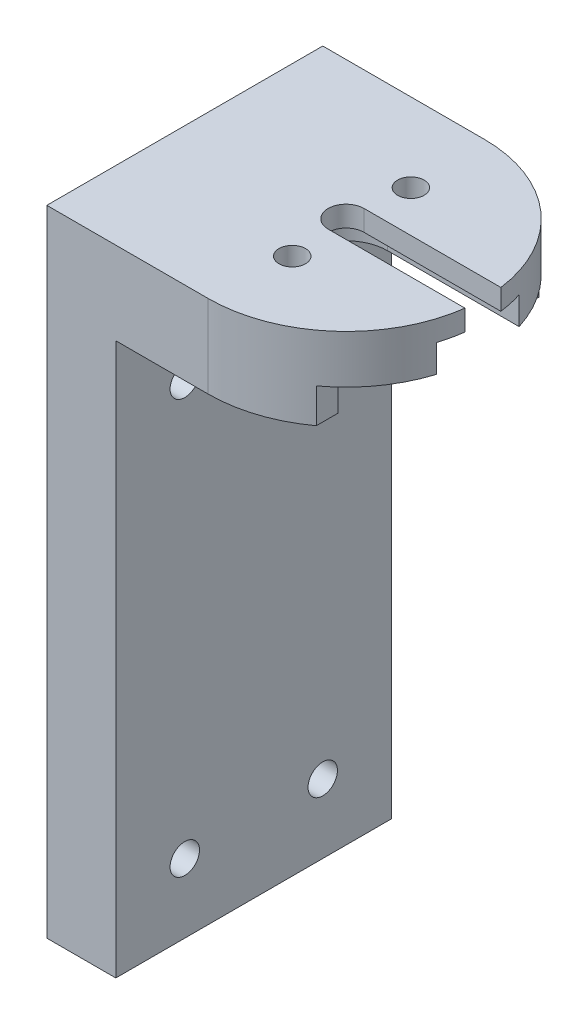
ISO-10303-21;
HEADER;
FILE_DESCRIPTION(('STEP AP214'),'2;1');
FILE_NAME('part.step','',(''),(''),'','','');
FILE_SCHEMA(('AUTOMOTIVE_DESIGN { 1 0 10303 214 1 1 1 1 }'));
ENDSEC;
DATA;
#1=APPLICATION_CONTEXT('core data for automotive mechanical design processes');
#2=APPLICATION_PROTOCOL_DEFINITION('international standard','automotive_design',2000,#1);
#3=PRODUCT_CONTEXT('',#1,'mechanical');
#4=PRODUCT('Part','Part','',(#3));
#5=PRODUCT_RELATED_PRODUCT_CATEGORY('part','',(#4));
#6=PRODUCT_DEFINITION_FORMATION('','',#4);
#7=PRODUCT_DEFINITION_CONTEXT('part definition',#1,'design');
#8=PRODUCT_DEFINITION('design','',#6,#7);
#9=PRODUCT_DEFINITION_SHAPE('','',#8);
#10=(LENGTH_UNIT() NAMED_UNIT(*) SI_UNIT(.MILLI.,.METRE.));
#11=(NAMED_UNIT(*) PLANE_ANGLE_UNIT() SI_UNIT($,.RADIAN.));
#12=(NAMED_UNIT(*) SI_UNIT($,.STERADIAN.) SOLID_ANGLE_UNIT());
#13=UNCERTAINTY_MEASURE_WITH_UNIT(LENGTH_MEASURE(1.E-05),#10,'distance_accuracy_value','');
#14=(GEOMETRIC_REPRESENTATION_CONTEXT(3) GLOBAL_UNCERTAINTY_ASSIGNED_CONTEXT((#13)) GLOBAL_UNIT_ASSIGNED_CONTEXT((#10,
#11,#12)) REPRESENTATION_CONTEXT('',''));
#15=CARTESIAN_POINT('',(0.,0.,0.));
#16=DIRECTION('',(0.,0.,1.));
#17=DIRECTION('',(1.,0.,0.));
#18=AXIS2_PLACEMENT_3D('',#15,#16,#17);
#19=CARTESIAN_POINT('',(-7.502,26.9920978176793,12.7));
#20=DIRECTION('',(0.,-1.,0.));
#21=DIRECTION('',(0.,0.,-1.));
#22=AXIS2_PLACEMENT_3D('',#19,#20,#21);
#23=CYLINDRICAL_SURFACE('',#22,1.651);
#24=CARTESIAN_POINT('',(-7.502,2.54,12.7));
#25=DIRECTION('',(0.,-1.,0.));
#26=DIRECTION('',(0.,0.,-1.));
#27=AXIS2_PLACEMENT_3D('',#24,#25,#26);
#28=CIRCLE('',#27,1.651);
#29=CARTESIAN_POINT('',(-7.502,2.54,11.049));
#30=VERTEX_POINT('',#29);
#31=CARTESIAN_POINT('',(-7.502,2.54,14.351));
#32=VERTEX_POINT('',#31);
#33=EDGE_CURVE('E322',#30,#32,#28,.F.);
#34=ORIENTED_EDGE('',*,*,#33,.F.);
#35=DIRECTION('',(0.,-1.,0.));
#36=VECTOR('',#35,1.);
#37=CARTESIAN_POINT('',(-7.502,26.9920978176793,11.049));
#38=LINE('',#37,#36);
#39=CARTESIAN_POINT('',(-7.502,4.44499999999999,11.049));
#40=VERTEX_POINT('',#39);
#41=EDGE_CURVE('E324',#40,#30,#38,.T.);
#42=ORIENTED_EDGE('',*,*,#41,.F.);
#43=CARTESIAN_POINT('',(-7.502,4.44499999999999,12.7));
#44=DIRECTION('',(0.,-1.,0.));
#45=DIRECTION('',(1.,0.,0.));
#46=AXIS2_PLACEMENT_3D('',#43,#44,#45);
#47=CIRCLE('',#46,1.651);
#48=CARTESIAN_POINT('',(-7.502,4.44499999999999,14.351));
#49=VERTEX_POINT('',#48);
#50=EDGE_CURVE('E327',#40,#49,#47,.F.);
#51=ORIENTED_EDGE('',*,*,#50,.T.);
#52=DIRECTION('',(0.,-1.,0.));
#53=VECTOR('',#52,1.);
#54=CARTESIAN_POINT('',(-7.502,26.9920978176793,14.351));
#55=LINE('',#54,#53);
#56=EDGE_CURVE('E328',#49,#32,#55,.T.);
#57=ORIENTED_EDGE('',*,*,#56,.T.);
#58=EDGE_LOOP('',(#34,#42,#51,#57));
#59=FACE_BOUND('',#58,.T.);
#60=ADVANCED_FACE('F57',(#59),#23,.F.);
#61=CARTESIAN_POINT('',(-7.502,26.9920978176793,14.351));
#62=DIRECTION('',(0.,0.,1.));
#63=DIRECTION('',(1.,0.,0.));
#64=AXIS2_PLACEMENT_3D('',#61,#62,#63);
#65=PLANE('',#64);
#66=DIRECTION('',(1.,0.,0.));
#67=VECTOR('',#66,1.);
#68=CARTESIAN_POINT('',(-7.50199999999999,4.44499999999999,14.351));
#69=LINE('',#68,#67);
#70=CARTESIAN_POINT('',(5.09022772189258,4.445,14.351));
#71=VERTEX_POINT('',#70);
#72=EDGE_CURVE('E325',#49,#71,#69,.T.);
#73=ORIENTED_EDGE('',*,*,#72,.T.);
#74=DIRECTION('',(0.,1.,0.));
#75=VECTOR('',#74,1.);
#76=CARTESIAN_POINT('',(5.09022772189259,-48.9655011983927,14.351));
#77=LINE('',#76,#75);
#78=CARTESIAN_POINT('',(5.09022772189258,2.54,14.351));
#79=VERTEX_POINT('',#78);
#80=EDGE_CURVE('E197',#71,#79,#77,.F.);
#81=ORIENTED_EDGE('',*,*,#80,.T.);
#82=DIRECTION('',(1.,0.,0.));
#83=VECTOR('',#82,1.);
#84=CARTESIAN_POINT('',(-7.502,2.54,14.351));
#85=LINE('',#84,#83);
#86=EDGE_CURVE('E317',#32,#79,#85,.T.);
#87=ORIENTED_EDGE('',*,*,#86,.F.);
#88=ORIENTED_EDGE('',*,*,#56,.F.);
#89=EDGE_LOOP('',(#73,#81,#87,#88));
#90=FACE_BOUND('',#89,.T.);
#91=ADVANCED_FACE('F397',(#90),#65,.F.);
#92=CARTESIAN_POINT('',(-7.502,26.9920978176793,11.049));
#93=DIRECTION('',(0.,0.,-1.));
#94=DIRECTION('',(-1.,0.,0.));
#95=AXIS2_PLACEMENT_3D('',#92,#93,#94);
#96=PLANE('',#95);
#97=DIRECTION('',(-1.,0.,0.));
#98=VECTOR('',#97,1.);
#99=CARTESIAN_POINT('',(-7.502,2.54,11.049));
#100=LINE('',#99,#98);
#101=CARTESIAN_POINT('',(5.09022772189258,2.54,11.049));
#102=VERTEX_POINT('',#101);
#103=EDGE_CURVE('E65',#102,#30,#100,.T.);
#104=ORIENTED_EDGE('',*,*,#103,.F.);
#105=DIRECTION('',(0.,1.,0.));
#106=VECTOR('',#105,1.);
#107=CARTESIAN_POINT('',(5.09022772189259,-48.9655011983927,11.049));
#108=LINE('',#107,#106);
#109=CARTESIAN_POINT('',(5.09022772189258,4.445,11.049));
#110=VERTEX_POINT('',#109);
#111=EDGE_CURVE('E384',#102,#110,#108,.T.);
#112=ORIENTED_EDGE('',*,*,#111,.T.);
#113=DIRECTION('',(-1.,0.,0.));
#114=VECTOR('',#113,1.);
#115=CARTESIAN_POINT('',(-7.50199999999999,4.44499999999999,11.049));
#116=LINE('',#115,#114);
#117=EDGE_CURVE('E330',#110,#40,#116,.T.);
#118=ORIENTED_EDGE('',*,*,#117,.T.);
#119=ORIENTED_EDGE('',*,*,#41,.T.);
#120=EDGE_LOOP('',(#104,#112,#118,#119));
#121=FACE_BOUND('',#120,.T.);
#122=ADVANCED_FACE('F406',(#121),#96,.F.);
#123=CARTESIAN_POINT('',(-16.002,-3.175,25.4));
#124=DIRECTION('',(0.,1.,0.));
#125=DIRECTION('',(-1.,0.,0.));
#126=AXIS2_PLACEMENT_3D('',#123,#124,#125);
#127=PLANE('',#126);
#128=DIRECTION('',(1.,0.,0.));
#129=VECTOR('',#128,1.);
#130=CARTESIAN_POINT('',(-16.002,-3.175,0.));
#131=LINE('',#130,#129);
#132=CARTESIAN_POINT('',(-16.002,-3.175,0.));
#133=VERTEX_POINT('',#132);
#134=CARTESIAN_POINT('',(-7.50199999999999,-3.175,0.));
#135=VERTEX_POINT('',#134);
#136=EDGE_CURVE('E234',#133,#135,#131,.T.);
#137=ORIENTED_EDGE('',*,*,#136,.T.);
#138=CARTESIAN_POINT('',(-7.50199999999999,-3.175,12.7));
#139=DIRECTION('',(0.,1.,0.));
#140=DIRECTION('',(-1.,0.,0.));
#141=AXIS2_PLACEMENT_3D('',#138,#139,#140);
#142=CIRCLE('',#141,12.7);
#143=CARTESIAN_POINT('',(0.,-3.175,2.45256149079195));
#144=VERTEX_POINT('',#143);
#145=EDGE_CURVE('E372',#144,#135,#142,.T.);
#146=ORIENTED_EDGE('',*,*,#145,.F.);
#147=DIRECTION('',(0.,0.,-1.));
#148=VECTOR('',#147,1.);
#149=CARTESIAN_POINT('',(0.,-3.175,25.4));
#150=LINE('',#149,#148);
#151=CARTESIAN_POINT('',(0.,-3.175,4.445));
#152=VERTEX_POINT('',#151);
#153=EDGE_CURVE('E242',#152,#144,#150,.T.);
#154=ORIENTED_EDGE('',*,*,#153,.F.);
#155=DIRECTION('',(1.,0.,0.));
#156=VECTOR('',#155,1.);
#157=CARTESIAN_POINT('',(-32.628474498758,-3.175,4.445));
#158=LINE('',#157,#156);
#159=CARTESIAN_POINT('',(-16.002,-3.175,4.445));
#160=VERTEX_POINT('',#159);
#161=EDGE_CURVE('E336',#160,#152,#158,.T.);
#162=ORIENTED_EDGE('',*,*,#161,.F.);
#163=DIRECTION('',(0.,0.,-1.));
#164=VECTOR('',#163,1.);
#165=CARTESIAN_POINT('',(-16.002,-3.175,25.4));
#166=LINE('',#165,#164);
#167=EDGE_CURVE('E245',#160,#133,#166,.T.);
#168=ORIENTED_EDGE('',*,*,#167,.T.);
#169=EDGE_LOOP('',(#137,#146,#154,#162,#168));
#170=FACE_BOUND('',#169,.T.);
#171=ADVANCED_FACE('F423',(#170),#127,.F.);
#172=CARTESIAN_POINT('',(0.,-3.175,25.4));
#173=DIRECTION('',(-1.,0.,0.));
#174=DIRECTION('',(0.,0.,1.));
#175=AXIS2_PLACEMENT_3D('',#172,#173,#174);
#176=PLANE('',#175);
#177=ORIENTED_EDGE('',*,*,#153,.T.);
#178=DIRECTION('',(0.,1.,0.));
#179=VECTOR('',#178,1.);
#180=CARTESIAN_POINT('',(0.,-48.9655011983927,2.45256149079195));
#181=LINE('',#180,#179);
#182=CARTESIAN_POINT('',(0.,0.,2.45256149079195));
#183=VERTEX_POINT('',#182);
#184=EDGE_CURVE('E381',#144,#183,#181,.T.);
#185=ORIENTED_EDGE('',*,*,#184,.T.);
#186=DIRECTION('',(0.,0.,-1.));
#187=VECTOR('',#186,1.);
#188=CARTESIAN_POINT('',(0.,0.,25.4));
#189=LINE('',#188,#187);
#190=CARTESIAN_POINT('',(0.,0.,4.445));
#191=VERTEX_POINT('',#190);
#192=EDGE_CURVE('E219',#191,#183,#189,.T.);
#193=ORIENTED_EDGE('',*,*,#192,.F.);
#194=DIRECTION('',(0.,-1.,0.));
#195=VECTOR('',#194,1.);
#196=CARTESIAN_POINT('',(0.,0.,4.445));
#197=LINE('',#196,#195);
#198=EDGE_CURVE('E337',#191,#152,#197,.T.);
#199=ORIENTED_EDGE('',*,*,#198,.T.);
#200=EDGE_LOOP('',(#177,#185,#193,#199));
#201=FACE_BOUND('',#200,.T.);
#202=ADVANCED_FACE('F436',(#201),#176,.F.);
#203=CARTESIAN_POINT('',(-22.352,4.44499999999999,25.4));
#204=DIRECTION('',(1.,0.,0.));
#205=DIRECTION('',(0.,1.,0.));
#206=AXIS2_PLACEMENT_3D('',#203,#204,#205);
#207=PLANE('',#206);
#208=CARTESIAN_POINT('',(-22.352,-9.525,6.35));
#209=DIRECTION('',(-1.,0.,0.));
#210=DIRECTION('',(0.,0.,1.));
#211=AXIS2_PLACEMENT_3D('',#208,#209,#210);
#212=CIRCLE('',#211,1.35255);
#213=CARTESIAN_POINT('',(-22.352,-9.525,7.70255));
#214=VERTEX_POINT('',#213);
#215=EDGE_CURVE('E270',#214,#214,#212,.T.);
#216=ORIENTED_EDGE('',*,*,#215,.F.);
#217=EDGE_LOOP('',(#216));
#218=FACE_BOUND('',#217,.T.);
#219=CARTESIAN_POINT('',(-22.352,-9.525,19.05));
#220=DIRECTION('',(-1.,0.,0.));
#221=DIRECTION('',(0.,0.,1.));
#222=AXIS2_PLACEMENT_3D('',#219,#220,#221);
#223=CIRCLE('',#222,1.35255);
#224=CARTESIAN_POINT('',(-22.352,-9.525,20.40255));
#225=VERTEX_POINT('',#224);
#226=EDGE_CURVE('E267',#225,#225,#223,.T.);
#227=ORIENTED_EDGE('',*,*,#226,.F.);
#228=EDGE_LOOP('',(#227));
#229=FACE_BOUND('',#228,.T.);
#230=CARTESIAN_POINT('',(-22.352,-47.625,6.35));
#231=DIRECTION('',(-1.,0.,0.));
#232=DIRECTION('',(0.,0.,1.));
#233=AXIS2_PLACEMENT_3D('',#230,#231,#232);
#234=CIRCLE('',#233,1.35255);
#235=CARTESIAN_POINT('',(-22.352,-47.625,7.70255));
#236=VERTEX_POINT('',#235);
#237=EDGE_CURVE('E264',#236,#236,#234,.T.);
#238=ORIENTED_EDGE('',*,*,#237,.F.);
#239=EDGE_LOOP('',(#238));
#240=FACE_BOUND('',#239,.T.);
#241=CARTESIAN_POINT('',(-22.352,-47.625,19.05));
#242=DIRECTION('',(-1.,0.,0.));
#243=DIRECTION('',(0.,0.,1.));
#244=AXIS2_PLACEMENT_3D('',#241,#242,#243);
#245=CIRCLE('',#244,1.35255);
#246=CARTESIAN_POINT('',(-22.352,-47.625,20.40255));
#247=VERTEX_POINT('',#246);
#248=EDGE_CURVE('E260',#247,#247,#245,.T.);
#249=ORIENTED_EDGE('',*,*,#248,.F.);
#250=EDGE_LOOP('',(#249));
#251=FACE_BOUND('',#250,.T.);
#252=DIRECTION('',(0.,-1.,0.));
#253=VECTOR('',#252,1.);
#254=CARTESIAN_POINT('',(-22.352,4.44499999999999,0.));
#255=LINE('',#254,#253);
#256=CARTESIAN_POINT('',(-22.352,4.44499999999999,0.));
#257=VERTEX_POINT('',#256);
#258=CARTESIAN_POINT('',(-22.352,-53.975,0.));
#259=VERTEX_POINT('',#258);
#260=EDGE_CURVE('E225',#257,#259,#255,.T.);
#261=ORIENTED_EDGE('',*,*,#260,.T.);
#262=DIRECTION('',(0.,0.,-1.));
#263=VECTOR('',#262,1.);
#264=CARTESIAN_POINT('',(-22.352,-53.975,25.4));
#265=LINE('',#264,#263);
#266=CARTESIAN_POINT('',(-22.352,-53.975,25.4));
#267=VERTEX_POINT('',#266);
#268=EDGE_CURVE('E252',#267,#259,#265,.T.);
#269=ORIENTED_EDGE('',*,*,#268,.F.);
#270=DIRECTION('',(0.,-1.,0.));
#271=VECTOR('',#270,1.);
#272=CARTESIAN_POINT('',(-22.352,4.44499999999999,25.4));
#273=LINE('',#272,#271);
#274=CARTESIAN_POINT('',(-22.352,4.44499999999999,25.4));
#275=VERTEX_POINT('',#274);
#276=EDGE_CURVE('E238',#275,#267,#273,.T.);
#277=ORIENTED_EDGE('',*,*,#276,.F.);
#278=DIRECTION('',(0.,0.,-1.));
#279=VECTOR('',#278,1.);
#280=CARTESIAN_POINT('',(-22.352,4.44499999999999,25.4));
#281=LINE('',#280,#279);
#282=EDGE_CURVE('E216',#275,#257,#281,.T.);
#283=ORIENTED_EDGE('',*,*,#282,.T.);
#284=EDGE_LOOP('',(#261,#269,#277,#283));
#285=FACE_BOUND('',#284,.T.);
#286=ADVANCED_FACE('F59',(#218,#229,#240,#251,#285),#207,.F.);
#287=CARTESIAN_POINT('',(-22.352,-53.975,25.4));
#288=DIRECTION('',(0.,1.,0.));
#289=DIRECTION('',(0.,0.,1.));
#290=AXIS2_PLACEMENT_3D('',#287,#288,#289);
#291=PLANE('',#290);
#292=DIRECTION('',(1.,0.,0.));
#293=VECTOR('',#292,1.);
#294=CARTESIAN_POINT('',(-22.352,-53.975,0.));
#295=LINE('',#294,#293);
#296=CARTESIAN_POINT('',(-16.002,-53.975,0.));
#297=VERTEX_POINT('',#296);
#298=EDGE_CURVE('E228',#259,#297,#295,.T.);
#299=ORIENTED_EDGE('',*,*,#298,.T.);
#300=DIRECTION('',(0.,0.,-1.));
#301=VECTOR('',#300,1.);
#302=CARTESIAN_POINT('',(-16.002,-53.975,25.4));
#303=LINE('',#302,#301);
#304=CARTESIAN_POINT('',(-16.002,-53.975,25.4));
#305=VERTEX_POINT('',#304);
#306=EDGE_CURVE('E249',#305,#297,#303,.T.);
#307=ORIENTED_EDGE('',*,*,#306,.F.);
#308=DIRECTION('',(1.,0.,0.));
#309=VECTOR('',#308,1.);
#310=CARTESIAN_POINT('',(-22.352,-53.975,25.4));
#311=LINE('',#310,#309);
#312=EDGE_CURVE('E360',#267,#305,#311,.T.);
#313=ORIENTED_EDGE('',*,*,#312,.F.);
#314=ORIENTED_EDGE('',*,*,#268,.T.);
#315=EDGE_LOOP('',(#299,#307,#313,#314));
#316=FACE_BOUND('',#315,.T.);
#317=ADVANCED_FACE('F419',(#316),#291,.F.);
#318=CARTESIAN_POINT('',(-16.002,-53.975,25.4));
#319=DIRECTION('',(-1.,0.,0.));
#320=DIRECTION('',(0.,0.,1.));
#321=AXIS2_PLACEMENT_3D('',#318,#319,#320);
#322=PLANE('',#321);
#323=CARTESIAN_POINT('',(-16.002,-9.525,6.35));
#324=DIRECTION('',(-1.,0.,0.));
#325=DIRECTION('',(0.,0.,1.));
#326=AXIS2_PLACEMENT_3D('',#323,#324,#325);
#327=CIRCLE('',#326,1.35255);
#328=CARTESIAN_POINT('',(-16.002,-9.525,7.70255));
#329=VERTEX_POINT('',#328);
#330=EDGE_CURVE('E268',#329,#329,#327,.T.);
#331=ORIENTED_EDGE('',*,*,#330,.T.);
#332=EDGE_LOOP('',(#331));
#333=FACE_BOUND('',#332,.T.);
#334=CARTESIAN_POINT('',(-16.002,-9.525,19.05));
#335=DIRECTION('',(-1.,0.,0.));
#336=DIRECTION('',(0.,0.,1.));
#337=AXIS2_PLACEMENT_3D('',#334,#335,#336);
#338=CIRCLE('',#337,1.35255);
#339=CARTESIAN_POINT('',(-16.002,-9.525,20.40255));
#340=VERTEX_POINT('',#339);
#341=EDGE_CURVE('E265',#340,#340,#338,.T.);
#342=ORIENTED_EDGE('',*,*,#341,.T.);
#343=EDGE_LOOP('',(#342));
#344=FACE_BOUND('',#343,.T.);
#345=CARTESIAN_POINT('',(-16.002,-47.625,6.35));
#346=DIRECTION('',(-1.,0.,0.));
#347=DIRECTION('',(0.,0.,1.));
#348=AXIS2_PLACEMENT_3D('',#345,#346,#347);
#349=CIRCLE('',#348,1.35255);
#350=CARTESIAN_POINT('',(-16.002,-47.625,7.70255));
#351=VERTEX_POINT('',#350);
#352=EDGE_CURVE('E261',#351,#351,#349,.T.);
#353=ORIENTED_EDGE('',*,*,#352,.T.);
#354=EDGE_LOOP('',(#353));
#355=FACE_BOUND('',#354,.T.);
#356=CARTESIAN_POINT('',(-16.002,-47.625,19.05));
#357=DIRECTION('',(-1.,0.,0.));
#358=DIRECTION('',(0.,0.,1.));
#359=AXIS2_PLACEMENT_3D('',#356,#357,#358);
#360=CIRCLE('',#359,1.35255);
#361=CARTESIAN_POINT('',(-16.002,-47.625,20.40255));
#362=VERTEX_POINT('',#361);
#363=EDGE_CURVE('E256',#362,#362,#360,.T.);
#364=ORIENTED_EDGE('',*,*,#363,.T.);
#365=EDGE_LOOP('',(#364));
#366=FACE_BOUND('',#365,.T.);
#367=DIRECTION('',(0.,1.,0.));
#368=VECTOR('',#367,1.);
#369=CARTESIAN_POINT('',(-16.002,-53.975,0.));
#370=LINE('',#369,#368);
#371=EDGE_CURVE('E231',#297,#133,#370,.T.);
#372=ORIENTED_EDGE('',*,*,#371,.T.);
#373=ORIENTED_EDGE('',*,*,#167,.F.);
#374=DIRECTION('',(0.,-1.,0.));
#375=VECTOR('',#374,1.);
#376=CARTESIAN_POINT('',(-16.002,0.,4.445));
#377=LINE('',#376,#375);
#378=CARTESIAN_POINT('',(-16.002,0.,4.445));
#379=VERTEX_POINT('',#378);
#380=EDGE_CURVE('E346',#379,#160,#377,.T.);
#381=ORIENTED_EDGE('',*,*,#380,.F.);
#382=DIRECTION('',(0.,0.,1.));
#383=VECTOR('',#382,1.);
#384=CARTESIAN_POINT('',(-16.002,0.,0.));
#385=LINE('',#384,#383);
#386=CARTESIAN_POINT('',(-16.002,0.,20.955));
#387=VERTEX_POINT('',#386);
#388=EDGE_CURVE('E340',#379,#387,#385,.T.);
#389=ORIENTED_EDGE('',*,*,#388,.T.);
#390=DIRECTION('',(0.,-1.,0.));
#391=VECTOR('',#390,1.);
#392=CARTESIAN_POINT('',(-16.002,0.,20.955));
#393=LINE('',#392,#391);
#394=CARTESIAN_POINT('',(-16.002,-3.175,20.955));
#395=VERTEX_POINT('',#394);
#396=EDGE_CURVE('E345',#387,#395,#393,.T.);
#397=ORIENTED_EDGE('',*,*,#396,.T.);
#398=CARTESIAN_POINT('',(-16.002,-3.175,25.4));
#399=VERTEX_POINT('',#398);
#400=EDGE_CURVE('E246',#399,#395,#166,.T.);
#401=ORIENTED_EDGE('',*,*,#400,.F.);
#402=DIRECTION('',(0.,1.,0.));
#403=VECTOR('',#402,1.);
#404=CARTESIAN_POINT('',(-16.002,-53.975,25.4));
#405=LINE('',#404,#403);
#406=EDGE_CURVE('E221',#305,#399,#405,.T.);
#407=ORIENTED_EDGE('',*,*,#406,.F.);
#408=ORIENTED_EDGE('',*,*,#306,.T.);
#409=EDGE_LOOP('',(#372,#373,#381,#389,#397,#401,#407,#408));
#410=FACE_BOUND('',#409,.T.);
#411=ADVANCED_FACE('F365',(#333,#344,#355,#366,#410),#322,.F.);
#412=CARTESIAN_POINT('',(0.,-3.175,22.947438509208));
#413=VERTEX_POINT('',#412);
#414=CARTESIAN_POINT('',(0.,-3.175,20.955));
#415=VERTEX_POINT('',#414);
#416=EDGE_CURVE('E243',#413,#415,#150,.T.);
#417=ORIENTED_EDGE('',*,*,#416,.F.);
#418=CARTESIAN_POINT('',(-7.502,-3.175,25.4));
#419=VERTEX_POINT('',#418);
#420=EDGE_CURVE('E370',#419,#413,#142,.T.);
#421=ORIENTED_EDGE('',*,*,#420,.F.);
#422=DIRECTION('',(1.,0.,0.));
#423=VECTOR('',#422,1.);
#424=CARTESIAN_POINT('',(-16.002,-3.175,25.4));
#425=LINE('',#424,#423);
#426=EDGE_CURVE('E211',#399,#419,#425,.T.);
#427=ORIENTED_EDGE('',*,*,#426,.F.);
#428=ORIENTED_EDGE('',*,*,#400,.T.);
#429=DIRECTION('',(1.,0.,0.));
#430=VECTOR('',#429,1.);
#431=CARTESIAN_POINT('',(-32.628474498758,-3.175,20.955));
#432=LINE('',#431,#430);
#433=EDGE_CURVE('E351',#395,#415,#432,.T.);
#434=ORIENTED_EDGE('',*,*,#433,.T.);
#435=EDGE_LOOP('',(#417,#421,#427,#428,#434));
#436=FACE_BOUND('',#435,.T.);
#437=ADVANCED_FACE('F369',(#436),#127,.F.);
#438=CARTESIAN_POINT('',(0.,0.,22.947438509208));
#439=VERTEX_POINT('',#438);
#440=CARTESIAN_POINT('',(0.,0.,20.955));
#441=VERTEX_POINT('',#440);
#442=EDGE_CURVE('E240',#439,#441,#189,.T.);
#443=ORIENTED_EDGE('',*,*,#442,.F.);
#444=DIRECTION('',(0.,1.,0.));
#445=VECTOR('',#444,1.);
#446=CARTESIAN_POINT('',(0.,-48.9655011983927,22.9474385092081));
#447=LINE('',#446,#445);
#448=EDGE_CURVE('E279',#439,#413,#447,.F.);
#449=ORIENTED_EDGE('',*,*,#448,.T.);
#450=ORIENTED_EDGE('',*,*,#416,.T.);
#451=DIRECTION('',(0.,-1.,0.));
#452=VECTOR('',#451,1.);
#453=CARTESIAN_POINT('',(0.,0.,20.955));
#454=LINE('',#453,#452);
#455=EDGE_CURVE('E342',#441,#415,#454,.T.);
#456=ORIENTED_EDGE('',*,*,#455,.F.);
#457=EDGE_LOOP('',(#443,#449,#450,#456));
#458=FACE_BOUND('',#457,.T.);
#459=ADVANCED_FACE('F483',(#458),#176,.F.);
#460=CARTESIAN_POINT('',(0.,0.,25.4));
#461=DIRECTION('',(0.,1.,0.));
#462=DIRECTION('',(0.,0.,1.));
#463=AXIS2_PLACEMENT_3D('',#460,#461,#462);
#464=PLANE('',#463);
#465=CARTESIAN_POINT('',(-7.002,0.,18.16));
#466=DIRECTION('',(0.,1.,0.));
#467=DIRECTION('',(0.,0.,1.));
#468=AXIS2_PLACEMENT_3D('',#465,#466,#467);
#469=CIRCLE('',#468,1.2192);
#470=CARTESIAN_POINT('',(-7.002,0.,19.3792));
#471=VERTEX_POINT('',#470);
#472=EDGE_CURVE('E289',#471,#471,#469,.T.);
#473=ORIENTED_EDGE('',*,*,#472,.T.);
#474=EDGE_LOOP('',(#473));
#475=FACE_BOUND('',#474,.T.);
#476=CARTESIAN_POINT('',(-7.002,0.,7.24));
#477=DIRECTION('',(0.,1.,0.));
#478=DIRECTION('',(0.,0.,1.));
#479=AXIS2_PLACEMENT_3D('',#476,#477,#478);
#480=CIRCLE('',#479,1.2192);
#481=CARTESIAN_POINT('',(-7.002,0.,8.4592));
#482=VERTEX_POINT('',#481);
#483=EDGE_CURVE('E295',#482,#482,#480,.T.);
#484=ORIENTED_EDGE('',*,*,#483,.T.);
#485=EDGE_LOOP('',(#484));
#486=FACE_BOUND('',#485,.T.);
#487=ORIENTED_EDGE('',*,*,#192,.T.);
#488=CARTESIAN_POINT('',(-7.50199999999999,0.,12.7));
#489=DIRECTION('',(0.,1.,0.));
#490=DIRECTION('',(0.,0.,1.));
#491=AXIS2_PLACEMENT_3D('',#488,#489,#490);
#492=CIRCLE('',#491,12.7);
#493=CARTESIAN_POINT('',(4.61302785799521,0.,8.89));
#494=VERTEX_POINT('',#493);
#495=EDGE_CURVE('E374',#183,#494,#492,.F.);
#496=ORIENTED_EDGE('',*,*,#495,.T.);
#497=DIRECTION('',(1.,0.,0.));
#498=VECTOR('',#497,1.);
#499=CARTESIAN_POINT('',(-7.502,0.,8.89));
#500=LINE('',#499,#498);
#501=CARTESIAN_POINT('',(-7.502,0.,8.89));
#502=VERTEX_POINT('',#501);
#503=EDGE_CURVE('E310',#502,#494,#500,.T.);
#504=ORIENTED_EDGE('',*,*,#503,.F.);
#505=CARTESIAN_POINT('',(-7.50199999999999,0.,12.7));
#506=DIRECTION('',(0.,-1.,0.));
#507=DIRECTION('',(0.,0.,-1.));
#508=AXIS2_PLACEMENT_3D('',#505,#506,#507);
#509=CIRCLE('',#508,3.81);
#510=CARTESIAN_POINT('',(-7.502,0.,16.51));
#511=VERTEX_POINT('',#510);
#512=EDGE_CURVE('E298',#511,#502,#509,.T.);
#513=ORIENTED_EDGE('',*,*,#512,.F.);
#514=DIRECTION('',(-1.,0.,0.));
#515=VECTOR('',#514,1.);
#516=CARTESIAN_POINT('',(-7.502,0.,16.51));
#517=LINE('',#516,#515);
#518=CARTESIAN_POINT('',(4.61302785799521,0.,16.51));
#519=VERTEX_POINT('',#518);
#520=EDGE_CURVE('E303',#519,#511,#517,.T.);
#521=ORIENTED_EDGE('',*,*,#520,.F.);
#522=EDGE_CURVE('E72',#519,#439,#492,.F.);
#523=ORIENTED_EDGE('',*,*,#522,.T.);
#524=ORIENTED_EDGE('',*,*,#442,.T.);
#525=DIRECTION('',(1.,0.,0.));
#526=VECTOR('',#525,1.);
#527=CARTESIAN_POINT('',(-32.628474498758,0.,20.955));
#528=LINE('',#527,#526);
#529=EDGE_CURVE('E229',#387,#441,#528,.T.);
#530=ORIENTED_EDGE('',*,*,#529,.F.);
#531=ORIENTED_EDGE('',*,*,#388,.F.);
#532=DIRECTION('',(1.,0.,0.));
#533=VECTOR('',#532,1.);
#534=CARTESIAN_POINT('',(-32.628474498758,0.,4.445));
#535=LINE('',#534,#533);
#536=EDGE_CURVE('E341',#379,#191,#535,.T.);
#537=ORIENTED_EDGE('',*,*,#536,.T.);
#538=EDGE_LOOP('',(#487,#496,#504,#513,#521,#523,#524,#530,#531,#537));
#539=FACE_BOUND('',#538,.T.);
#540=ADVANCED_FACE('F434',(#475,#486,#539),#464,.F.);
#541=CARTESIAN_POINT('',(25.654,4.445,25.4));
#542=DIRECTION('',(0.,-1.,0.));
#543=DIRECTION('',(1.,0.,0.));
#544=AXIS2_PLACEMENT_3D('',#541,#542,#543);
#545=PLANE('',#544);
#546=CARTESIAN_POINT('',(-7.002,4.44499999999999,18.16));
#547=DIRECTION('',(0.,1.,0.));
#548=DIRECTION('',(0.,0.,1.));
#549=AXIS2_PLACEMENT_3D('',#546,#547,#548);
#550=CIRCLE('',#549,1.2192);
#551=CARTESIAN_POINT('',(-7.002,4.44499999999999,19.3792));
#552=VERTEX_POINT('',#551);
#553=EDGE_CURVE('E259',#552,#552,#550,.T.);
#554=ORIENTED_EDGE('',*,*,#553,.F.);
#555=EDGE_LOOP('',(#554));
#556=FACE_BOUND('',#555,.T.);
#557=CARTESIAN_POINT('',(-7.002,4.44499999999999,7.24));
#558=DIRECTION('',(0.,1.,0.));
#559=DIRECTION('',(0.,0.,1.));
#560=AXIS2_PLACEMENT_3D('',#557,#558,#559);
#561=CIRCLE('',#560,1.2192);
#562=CARTESIAN_POINT('',(-7.002,4.44499999999999,8.4592));
#563=VERTEX_POINT('',#562);
#564=EDGE_CURVE('E292',#563,#563,#561,.T.);
#565=ORIENTED_EDGE('',*,*,#564,.F.);
#566=EDGE_LOOP('',(#565));
#567=FACE_BOUND('',#566,.T.);
#568=DIRECTION('',(-1.,0.,0.));
#569=VECTOR('',#568,1.);
#570=CARTESIAN_POINT('',(25.654,4.445,25.4));
#571=LINE('',#570,#569);
#572=CARTESIAN_POINT('',(-7.502,4.44499999999999,25.4));
#573=VERTEX_POINT('',#572);
#574=EDGE_CURVE('E208',#573,#275,#571,.T.);
#575=ORIENTED_EDGE('',*,*,#574,.F.);
#576=CARTESIAN_POINT('',(-7.502,4.44499999999999,12.7));
#577=DIRECTION('',(0.,-1.,0.));
#578=DIRECTION('',(-1.,0.,0.));
#579=AXIS2_PLACEMENT_3D('',#576,#577,#578);
#580=CIRCLE('',#579,12.7);
#581=EDGE_CURVE('E191',#71,#573,#580,.T.);
#582=ORIENTED_EDGE('',*,*,#581,.F.);
#583=ORIENTED_EDGE('',*,*,#72,.F.);
#584=ORIENTED_EDGE('',*,*,#50,.F.);
#585=ORIENTED_EDGE('',*,*,#117,.F.);
#586=CARTESIAN_POINT('',(-7.502,4.44499999999999,0.));
#587=VERTEX_POINT('',#586);
#588=EDGE_CURVE('E202',#587,#110,#580,.T.);
#589=ORIENTED_EDGE('',*,*,#588,.F.);
#590=DIRECTION('',(-1.,0.,0.));
#591=VECTOR('',#590,1.);
#592=CARTESIAN_POINT('',(25.654,4.445,0.));
#593=LINE('',#592,#591);
#594=EDGE_CURVE('E237',#587,#257,#593,.T.);
#595=ORIENTED_EDGE('',*,*,#594,.T.);
#596=ORIENTED_EDGE('',*,*,#282,.F.);
#597=EDGE_LOOP('',(#575,#582,#583,#584,#585,#589,#595,#596));
#598=FACE_BOUND('',#597,.T.);
#599=ADVANCED_FACE('F214',(#556,#567,#598),#545,.F.);
#600=CARTESIAN_POINT('',(0.,0.,25.4));
#601=DIRECTION('',(0.,0.,1.));
#602=DIRECTION('',(1.,0.,0.));
#603=AXIS2_PLACEMENT_3D('',#600,#601,#602);
#604=PLANE('',#603);
#605=DIRECTION('',(0.,1.,0.));
#606=VECTOR('',#605,1.);
#607=CARTESIAN_POINT('',(-7.50199999999999,-48.9655011983927,25.4));
#608=LINE('',#607,#606);
#609=EDGE_CURVE('E194',#419,#573,#608,.T.);
#610=ORIENTED_EDGE('',*,*,#609,.T.);
#611=ORIENTED_EDGE('',*,*,#574,.T.);
#612=ORIENTED_EDGE('',*,*,#276,.T.);
#613=ORIENTED_EDGE('',*,*,#312,.T.);
#614=ORIENTED_EDGE('',*,*,#406,.T.);
#615=ORIENTED_EDGE('',*,*,#426,.T.);
#616=EDGE_LOOP('',(#610,#611,#612,#613,#614,#615));
#617=FACE_BOUND('',#616,.T.);
#618=ADVANCED_FACE('F206',(#617),#604,.T.);
#619=CARTESIAN_POINT('',(0.,0.,0.));
#620=DIRECTION('',(0.,0.,1.));
#621=DIRECTION('',(1.,0.,0.));
#622=AXIS2_PLACEMENT_3D('',#619,#620,#621);
#623=PLANE('',#622);
#624=ORIENTED_EDGE('',*,*,#594,.F.);
#625=DIRECTION('',(0.,1.,0.));
#626=VECTOR('',#625,1.);
#627=CARTESIAN_POINT('',(-7.50199999999999,-48.9655011983927,0.));
#628=LINE('',#627,#626);
#629=EDGE_CURVE('E212',#135,#587,#628,.T.);
#630=ORIENTED_EDGE('',*,*,#629,.F.);
#631=ORIENTED_EDGE('',*,*,#136,.F.);
#632=ORIENTED_EDGE('',*,*,#371,.F.);
#633=ORIENTED_EDGE('',*,*,#298,.F.);
#634=ORIENTED_EDGE('',*,*,#260,.F.);
#635=EDGE_LOOP('',(#624,#630,#631,#632,#633,#634));
#636=FACE_BOUND('',#635,.T.);
#637=ADVANCED_FACE('F413',(#636),#623,.F.);
#638=CARTESIAN_POINT('',(-32.628474498758,0.,4.445));
#639=DIRECTION('',(0.,0.,1.));
#640=DIRECTION('',(0.,-1.,0.));
#641=AXIS2_PLACEMENT_3D('',#638,#639,#640);
#642=PLANE('',#641);
#643=ORIENTED_EDGE('',*,*,#380,.T.);
#644=ORIENTED_EDGE('',*,*,#161,.T.);
#645=ORIENTED_EDGE('',*,*,#198,.F.);
#646=ORIENTED_EDGE('',*,*,#536,.F.);
#647=EDGE_LOOP('',(#643,#644,#645,#646));
#648=FACE_BOUND('',#647,.T.);
#649=ADVANCED_FACE('F431',(#648),#642,.T.);
#650=CARTESIAN_POINT('',(-32.628474498758,0.,20.955));
#651=DIRECTION('',(0.,0.,1.));
#652=DIRECTION('',(1.,0.,0.));
#653=AXIS2_PLACEMENT_3D('',#650,#651,#652);
#654=PLANE('',#653);
#655=ORIENTED_EDGE('',*,*,#529,.T.);
#656=ORIENTED_EDGE('',*,*,#455,.T.);
#657=ORIENTED_EDGE('',*,*,#433,.F.);
#658=ORIENTED_EDGE('',*,*,#396,.F.);
#659=EDGE_LOOP('',(#655,#656,#657,#658));
#660=FACE_BOUND('',#659,.T.);
#661=ADVANCED_FACE('F470',(#660),#654,.F.);
#662=CARTESIAN_POINT('',(-7.50199999999999,2.54,12.7));
#663=DIRECTION('',(0.,-1.,0.));
#664=DIRECTION('',(0.,0.,-1.));
#665=AXIS2_PLACEMENT_3D('',#662,#663,#664);
#666=PLANE('',#665);
#667=CARTESIAN_POINT('',(-7.502,2.54,12.7));
#668=DIRECTION('',(0.,-1.,0.));
#669=DIRECTION('',(0.,0.,-1.));
#670=AXIS2_PLACEMENT_3D('',#667,#668,#669);
#671=CIRCLE('',#670,12.7);
#672=CARTESIAN_POINT('',(4.61302785799521,2.54,16.51));
#673=VERTEX_POINT('',#672);
#674=EDGE_CURVE('E376',#673,#79,#671,.F.);
#675=ORIENTED_EDGE('',*,*,#674,.F.);
#676=DIRECTION('',(-1.,0.,0.));
#677=VECTOR('',#676,1.);
#678=CARTESIAN_POINT('',(-7.502,2.54,16.51));
#679=LINE('',#678,#677);
#680=CARTESIAN_POINT('',(-7.502,2.54,16.51));
#681=VERTEX_POINT('',#680);
#682=EDGE_CURVE('E306',#673,#681,#679,.T.);
#683=ORIENTED_EDGE('',*,*,#682,.T.);
#684=CARTESIAN_POINT('',(-7.50199999999999,2.54,12.7));
#685=DIRECTION('',(0.,-1.,0.));
#686=DIRECTION('',(0.,0.,-1.));
#687=AXIS2_PLACEMENT_3D('',#684,#685,#686);
#688=CIRCLE('',#687,3.81);
#689=CARTESIAN_POINT('',(-7.502,2.54,8.89));
#690=VERTEX_POINT('',#689);
#691=EDGE_CURVE('E299',#681,#690,#688,.T.);
#692=ORIENTED_EDGE('',*,*,#691,.T.);
#693=DIRECTION('',(1.,0.,0.));
#694=VECTOR('',#693,1.);
#695=CARTESIAN_POINT('',(-7.502,2.54,8.89));
#696=LINE('',#695,#694);
#697=CARTESIAN_POINT('',(4.61302785799521,2.54,8.89));
#698=VERTEX_POINT('',#697);
#699=EDGE_CURVE('E302',#690,#698,#696,.T.);
#700=ORIENTED_EDGE('',*,*,#699,.T.);
#701=EDGE_CURVE('E80',#102,#698,#671,.F.);
#702=ORIENTED_EDGE('',*,*,#701,.F.);
#703=ORIENTED_EDGE('',*,*,#103,.T.);
#704=ORIENTED_EDGE('',*,*,#33,.T.);
#705=ORIENTED_EDGE('',*,*,#86,.T.);
#706=EDGE_LOOP('',(#675,#683,#692,#700,#702,#703,#704,#705));
#707=FACE_BOUND('',#706,.T.);
#708=ADVANCED_FACE('F399',(#707),#666,.T.);
#709=CARTESIAN_POINT('',(-7.50199999999999,2.54,12.7));
#710=DIRECTION('',(0.,-1.,0.));
#711=DIRECTION('',(0.,0.,-1.));
#712=AXIS2_PLACEMENT_3D('',#709,#710,#711);
#713=CYLINDRICAL_SURFACE('',#712,3.81);
#714=ORIENTED_EDGE('',*,*,#512,.T.);
#715=DIRECTION('',(0.,-1.,0.));
#716=VECTOR('',#715,1.);
#717=CARTESIAN_POINT('',(-7.502,2.54,8.89));
#718=LINE('',#717,#716);
#719=EDGE_CURVE('E308',#690,#502,#718,.T.);
#720=ORIENTED_EDGE('',*,*,#719,.F.);
#721=ORIENTED_EDGE('',*,*,#691,.F.);
#722=DIRECTION('',(0.,-1.,0.));
#723=VECTOR('',#722,1.);
#724=CARTESIAN_POINT('',(-7.502,2.54,16.51));
#725=LINE('',#724,#723);
#726=EDGE_CURVE('E314',#681,#511,#725,.T.);
#727=ORIENTED_EDGE('',*,*,#726,.T.);
#728=EDGE_LOOP('',(#714,#720,#721,#727));
#729=FACE_BOUND('',#728,.T.);
#730=ADVANCED_FACE('F445',(#729),#713,.F.);
#731=CARTESIAN_POINT('',(-7.502,2.54,16.51));
#732=DIRECTION('',(0.,0.,1.));
#733=DIRECTION('',(1.,0.,0.));
#734=AXIS2_PLACEMENT_3D('',#731,#732,#733);
#735=PLANE('',#734);
#736=ORIENTED_EDGE('',*,*,#682,.F.);
#737=DIRECTION('',(0.,1.,0.));
#738=VECTOR('',#737,1.);
#739=CARTESIAN_POINT('',(4.61302785799522,-48.9655011983927,16.51));
#740=LINE('',#739,#738);
#741=EDGE_CURVE('E387',#673,#519,#740,.F.);
#742=ORIENTED_EDGE('',*,*,#741,.T.);
#743=ORIENTED_EDGE('',*,*,#520,.T.);
#744=ORIENTED_EDGE('',*,*,#726,.F.);
#745=EDGE_LOOP('',(#736,#742,#743,#744));
#746=FACE_BOUND('',#745,.T.);
#747=ADVANCED_FACE('F448',(#746),#735,.F.);
#748=CARTESIAN_POINT('',(-7.502,2.54,8.89));
#749=DIRECTION('',(0.,0.,-1.));
#750=DIRECTION('',(-1.,0.,0.));
#751=AXIS2_PLACEMENT_3D('',#748,#749,#750);
#752=PLANE('',#751);
#753=ORIENTED_EDGE('',*,*,#503,.T.);
#754=DIRECTION('',(0.,1.,0.));
#755=VECTOR('',#754,1.);
#756=CARTESIAN_POINT('',(4.61302785799522,-48.9655011983927,8.89));
#757=LINE('',#756,#755);
#758=EDGE_CURVE('E12',#494,#698,#757,.T.);
#759=ORIENTED_EDGE('',*,*,#758,.T.);
#760=ORIENTED_EDGE('',*,*,#699,.F.);
#761=ORIENTED_EDGE('',*,*,#719,.T.);
#762=EDGE_LOOP('',(#753,#759,#760,#761));
#763=FACE_BOUND('',#762,.T.);
#764=ADVANCED_FACE('F441',(#763),#752,.F.);
#765=CARTESIAN_POINT('',(-7.002,4.44499999999999,7.24));
#766=DIRECTION('',(0.,1.,0.));
#767=DIRECTION('',(0.,0.,1.));
#768=AXIS2_PLACEMENT_3D('',#765,#766,#767);
#769=CYLINDRICAL_SURFACE('',#768,1.2192);
#770=ORIENTED_EDGE('',*,*,#564,.T.);
#771=EDGE_LOOP('',(#770));
#772=FACE_BOUND('',#771,.T.);
#773=ORIENTED_EDGE('',*,*,#483,.F.);
#774=EDGE_LOOP('',(#773));
#775=FACE_BOUND('',#774,.T.);
#776=ADVANCED_FACE('F455',(#772,#775),#769,.F.);
#777=CARTESIAN_POINT('',(-7.002,4.44499999999999,18.16));
#778=DIRECTION('',(0.,1.,0.));
#779=DIRECTION('',(0.,0.,1.));
#780=AXIS2_PLACEMENT_3D('',#777,#778,#779);
#781=CYLINDRICAL_SURFACE('',#780,1.2192);
#782=ORIENTED_EDGE('',*,*,#553,.T.);
#783=EDGE_LOOP('',(#782));
#784=FACE_BOUND('',#783,.T.);
#785=ORIENTED_EDGE('',*,*,#472,.F.);
#786=EDGE_LOOP('',(#785));
#787=FACE_BOUND('',#786,.T.);
#788=ADVANCED_FACE('F512',(#784,#787),#781,.F.);
#789=CARTESIAN_POINT('',(-22.352,-47.625,19.05));
#790=DIRECTION('',(-1.,0.,0.));
#791=DIRECTION('',(0.,0.,1.));
#792=AXIS2_PLACEMENT_3D('',#789,#790,#791);
#793=CYLINDRICAL_SURFACE('',#792,1.35255);
#794=ORIENTED_EDGE('',*,*,#248,.T.);
#795=EDGE_LOOP('',(#794));
#796=FACE_BOUND('',#795,.T.);
#797=ORIENTED_EDGE('',*,*,#363,.F.);
#798=EDGE_LOOP('',(#797));
#799=FACE_BOUND('',#798,.T.);
#800=ADVANCED_FACE('F508',(#796,#799),#793,.F.);
#801=CARTESIAN_POINT('',(-22.352,-47.625,6.35));
#802=DIRECTION('',(-1.,0.,0.));
#803=DIRECTION('',(0.,0.,1.));
#804=AXIS2_PLACEMENT_3D('',#801,#802,#803);
#805=CYLINDRICAL_SURFACE('',#804,1.35255);
#806=ORIENTED_EDGE('',*,*,#237,.T.);
#807=EDGE_LOOP('',(#806));
#808=FACE_BOUND('',#807,.T.);
#809=ORIENTED_EDGE('',*,*,#352,.F.);
#810=EDGE_LOOP('',(#809));
#811=FACE_BOUND('',#810,.T.);
#812=ADVANCED_FACE('F511',(#808,#811),#805,.F.);
#813=CARTESIAN_POINT('',(-22.352,-9.525,19.05));
#814=DIRECTION('',(-1.,0.,0.));
#815=DIRECTION('',(0.,0.,1.));
#816=AXIS2_PLACEMENT_3D('',#813,#814,#815);
#817=CYLINDRICAL_SURFACE('',#816,1.35255);
#818=ORIENTED_EDGE('',*,*,#226,.T.);
#819=EDGE_LOOP('',(#818));
#820=FACE_BOUND('',#819,.T.);
#821=ORIENTED_EDGE('',*,*,#341,.F.);
#822=EDGE_LOOP('',(#821));
#823=FACE_BOUND('',#822,.T.);
#824=ADVANCED_FACE('F520',(#820,#823),#817,.F.);
#825=CARTESIAN_POINT('',(-22.352,-9.525,6.35));
#826=DIRECTION('',(-1.,0.,0.));
#827=DIRECTION('',(0.,0.,1.));
#828=AXIS2_PLACEMENT_3D('',#825,#826,#827);
#829=CYLINDRICAL_SURFACE('',#828,1.35255);
#830=ORIENTED_EDGE('',*,*,#215,.T.);
#831=EDGE_LOOP('',(#830));
#832=FACE_BOUND('',#831,.T.);
#833=ORIENTED_EDGE('',*,*,#330,.F.);
#834=EDGE_LOOP('',(#833));
#835=FACE_BOUND('',#834,.T.);
#836=ADVANCED_FACE('F572',(#832,#835),#829,.F.);
#837=CARTESIAN_POINT('',(-7.50199999999999,-48.9655011983927,12.7));
#838=DIRECTION('',(0.,1.,0.));
#839=DIRECTION('',(-1.,0.,0.));
#840=AXIS2_PLACEMENT_3D('',#837,#838,#839);
#841=CYLINDRICAL_SURFACE('',#840,12.7);
#842=ORIENTED_EDGE('',*,*,#701,.T.);
#843=ORIENTED_EDGE('',*,*,#758,.F.);
#844=ORIENTED_EDGE('',*,*,#495,.F.);
#845=ORIENTED_EDGE('',*,*,#184,.F.);
#846=ORIENTED_EDGE('',*,*,#145,.T.);
#847=ORIENTED_EDGE('',*,*,#629,.T.);
#848=ORIENTED_EDGE('',*,*,#588,.T.);
#849=ORIENTED_EDGE('',*,*,#111,.F.);
#850=EDGE_LOOP('',(#842,#843,#844,#845,#846,#847,#848,#849));
#851=FACE_BOUND('',#850,.T.);
#852=ADVANCED_FACE('F437',(#851),#841,.T.);
#853=ORIENTED_EDGE('',*,*,#581,.T.);
#854=ORIENTED_EDGE('',*,*,#609,.F.);
#855=ORIENTED_EDGE('',*,*,#420,.T.);
#856=ORIENTED_EDGE('',*,*,#448,.F.);
#857=ORIENTED_EDGE('',*,*,#522,.F.);
#858=ORIENTED_EDGE('',*,*,#741,.F.);
#859=ORIENTED_EDGE('',*,*,#674,.T.);
#860=ORIENTED_EDGE('',*,*,#80,.F.);
#861=EDGE_LOOP('',(#853,#854,#855,#856,#857,#858,#859,#860));
#862=FACE_BOUND('',#861,.T.);
#863=ADVANCED_FACE('F193',(#862),#841,.T.);
#864=CLOSED_SHELL('',(#60,#91,#122,#171,#202,#286,#317,#411,#437,#459,#540,#599,#618,#637,#649,
#661,#708,#730,#747,#764,#776,#788,#800,#812,#824,#836,#852,#863));
#865=MANIFOLD_SOLID_BREP('B2',#864);
#866=ADVANCED_BREP_SHAPE_REPRESENTATION('',(#18,#865),#14);
#867=SHAPE_DEFINITION_REPRESENTATION(#9,#866);
ENDSEC;
END-ISO-10303-21;
